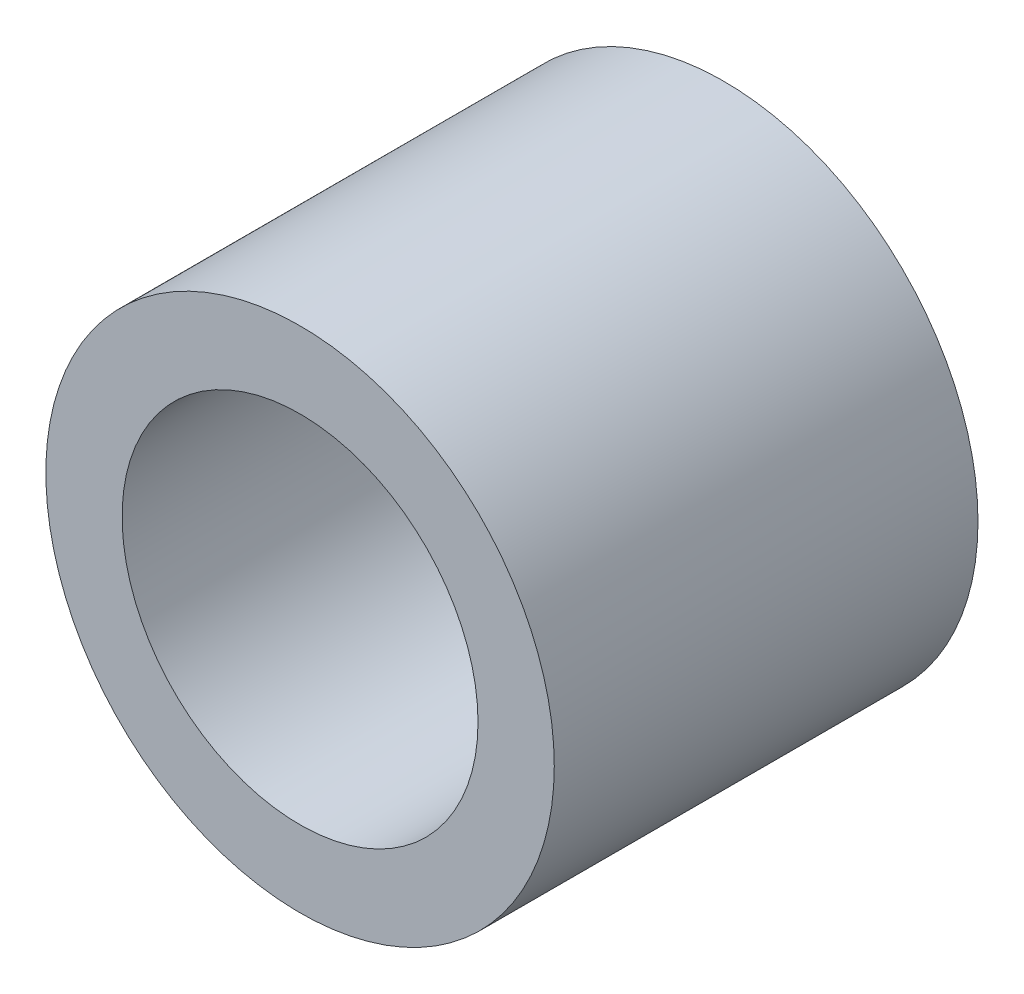
ISO-10303-21;
HEADER;
FILE_DESCRIPTION(('STEP AP214'),'2;1');
FILE_NAME('part.step','',(''),(''),'','','');
FILE_SCHEMA(('AUTOMOTIVE_DESIGN { 1 0 10303 214 1 1 1 1 }'));
ENDSEC;
DATA;
#1=APPLICATION_CONTEXT('core data for automotive mechanical design processes');
#2=APPLICATION_PROTOCOL_DEFINITION('international standard','automotive_design',2000,#1);
#3=PRODUCT_CONTEXT('',#1,'mechanical');
#4=PRODUCT('Part','Part','',(#3));
#5=PRODUCT_RELATED_PRODUCT_CATEGORY('part','',(#4));
#6=PRODUCT_DEFINITION_FORMATION('','',#4);
#7=PRODUCT_DEFINITION_CONTEXT('part definition',#1,'design');
#8=PRODUCT_DEFINITION('design','',#6,#7);
#9=PRODUCT_DEFINITION_SHAPE('','',#8);
#10=(LENGTH_UNIT() NAMED_UNIT(*) SI_UNIT(.MILLI.,.METRE.));
#11=(NAMED_UNIT(*) PLANE_ANGLE_UNIT() SI_UNIT($,.RADIAN.));
#12=(NAMED_UNIT(*) SI_UNIT($,.STERADIAN.) SOLID_ANGLE_UNIT());
#13=UNCERTAINTY_MEASURE_WITH_UNIT(LENGTH_MEASURE(1.E-05),#10,'distance_accuracy_value','');
#14=(GEOMETRIC_REPRESENTATION_CONTEXT(3) GLOBAL_UNCERTAINTY_ASSIGNED_CONTEXT((#13)) GLOBAL_UNIT_ASSIGNED_CONTEXT((#10,
#11,#12)) REPRESENTATION_CONTEXT('',''));
#15=CARTESIAN_POINT('',(0.,0.,0.));
#16=DIRECTION('',(0.,0.,1.));
#17=DIRECTION('',(1.,0.,0.));
#18=AXIS2_PLACEMENT_3D('',#15,#16,#17);
#19=CARTESIAN_POINT('',(0.,0.,2.5));
#20=DIRECTION('',(0.,0.,1.));
#21=DIRECTION('',(1.,0.,0.));
#22=AXIS2_PLACEMENT_3D('',#19,#20,#21);
#23=PLANE('',#22);
#24=CARTESIAN_POINT('',(0.,0.,2.5));
#25=DIRECTION('',(0.,0.,1.));
#26=DIRECTION('',(1.,0.,0.));
#27=AXIS2_PLACEMENT_3D('',#24,#25,#26);
#28=CIRCLE('',#27,1.5);
#29=CARTESIAN_POINT('',(1.5,0.,2.5));
#30=VERTEX_POINT('',#29);
#31=EDGE_CURVE('E10',#30,#30,#28,.T.);
#32=ORIENTED_EDGE('',*,*,#31,.T.);
#33=EDGE_LOOP('',(#32));
#34=FACE_BOUND('',#33,.T.);
#35=CARTESIAN_POINT('',(0.,0.,2.5));
#36=DIRECTION('',(0.,0.,1.));
#37=DIRECTION('',(1.,0.,0.));
#38=AXIS2_PLACEMENT_3D('',#35,#36,#37);
#39=CIRCLE('',#38,1.05);
#40=CARTESIAN_POINT('',(1.05,0.,2.5));
#41=VERTEX_POINT('',#40);
#42=EDGE_CURVE('E49',#41,#41,#39,.T.);
#43=ORIENTED_EDGE('',*,*,#42,.F.);
#44=EDGE_LOOP('',(#43));
#45=FACE_BOUND('',#44,.T.);
#46=ADVANCED_FACE('F39',(#34,#45),#23,.T.);
#47=CARTESIAN_POINT('',(0.,0.,0.));
#48=DIRECTION('',(0.,0.,1.));
#49=DIRECTION('',(1.,0.,0.));
#50=AXIS2_PLACEMENT_3D('',#47,#48,#49);
#51=PLANE('',#50);
#52=CARTESIAN_POINT('',(0.,0.,0.));
#53=DIRECTION('',(0.,0.,1.));
#54=DIRECTION('',(1.,0.,0.));
#55=AXIS2_PLACEMENT_3D('',#52,#53,#54);
#56=CIRCLE('',#55,1.5);
#57=CARTESIAN_POINT('',(1.5,0.,0.));
#58=VERTEX_POINT('',#57);
#59=EDGE_CURVE('E43',#58,#58,#56,.T.);
#60=ORIENTED_EDGE('',*,*,#59,.F.);
#61=EDGE_LOOP('',(#60));
#62=FACE_BOUND('',#61,.T.);
#63=CARTESIAN_POINT('',(0.,0.,0.));
#64=DIRECTION('',(0.,0.,1.));
#65=DIRECTION('',(1.,0.,0.));
#66=AXIS2_PLACEMENT_3D('',#63,#64,#65);
#67=CIRCLE('',#66,1.05);
#68=CARTESIAN_POINT('',(1.05,0.,0.));
#69=VERTEX_POINT('',#68);
#70=EDGE_CURVE('E55',#69,#69,#67,.T.);
#71=ORIENTED_EDGE('',*,*,#70,.T.);
#72=EDGE_LOOP('',(#71));
#73=FACE_BOUND('',#72,.T.);
#74=ADVANCED_FACE('F65',(#62,#73),#51,.F.);
#75=CARTESIAN_POINT('',(0.,0.,2.5));
#76=DIRECTION('',(0.,0.,-1.));
#77=DIRECTION('',(-1.,0.,0.));
#78=AXIS2_PLACEMENT_3D('',#75,#76,#77);
#79=CYLINDRICAL_SURFACE('',#78,1.5);
#80=ORIENTED_EDGE('',*,*,#31,.F.);
#81=EDGE_LOOP('',(#80));
#82=FACE_BOUND('',#81,.T.);
#83=ORIENTED_EDGE('',*,*,#59,.T.);
#84=EDGE_LOOP('',(#83));
#85=FACE_BOUND('',#84,.T.);
#86=ADVANCED_FACE('F41',(#82,#85),#79,.T.);
#87=CARTESIAN_POINT('',(0.,0.,2.5));
#88=DIRECTION('',(0.,0.,-1.));
#89=DIRECTION('',(-1.,0.,0.));
#90=AXIS2_PLACEMENT_3D('',#87,#88,#89);
#91=CYLINDRICAL_SURFACE('',#90,1.05);
#92=ORIENTED_EDGE('',*,*,#42,.T.);
#93=EDGE_LOOP('',(#92));
#94=FACE_BOUND('',#93,.T.);
#95=ORIENTED_EDGE('',*,*,#70,.F.);
#96=EDGE_LOOP('',(#95));
#97=FACE_BOUND('',#96,.T.);
#98=ADVANCED_FACE('F59',(#94,#97),#91,.F.);
#99=CLOSED_SHELL('',(#46,#74,#86,#98));
#100=MANIFOLD_SOLID_BREP('B2',#99);
#101=ADVANCED_BREP_SHAPE_REPRESENTATION('',(#18,#100),#14);
#102=SHAPE_DEFINITION_REPRESENTATION(#9,#101);
ENDSEC;
END-ISO-10303-21;
